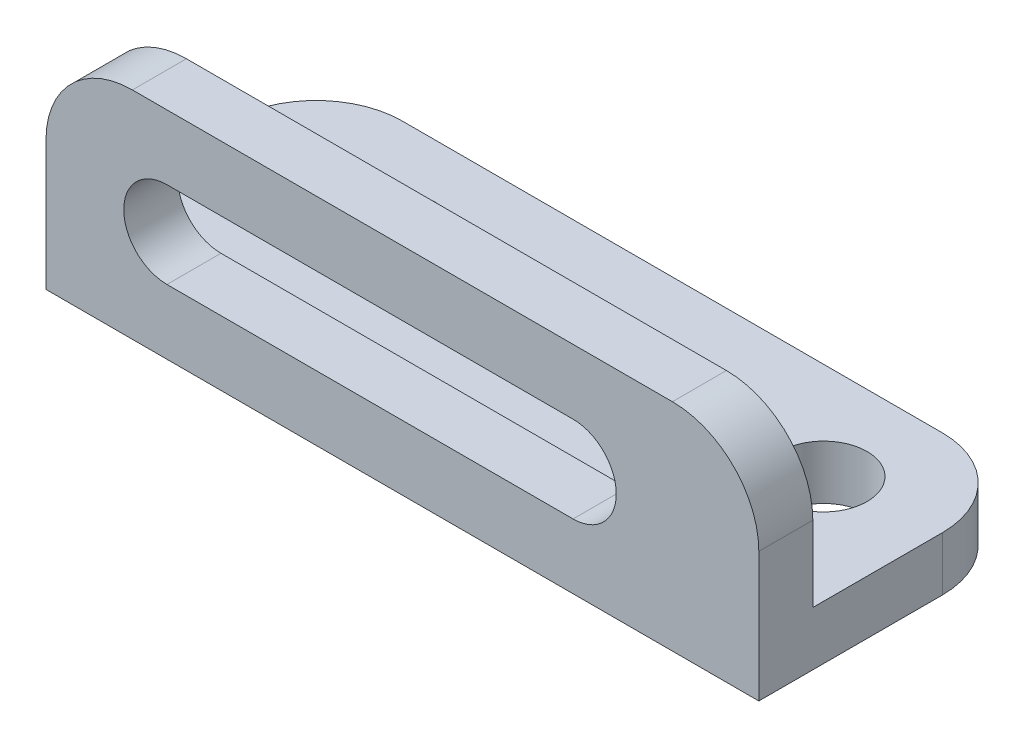
ISO-10303-21;
HEADER;
FILE_DESCRIPTION(('STEP AP214'),'2;1');
FILE_NAME('part.step','',(''),(''),'','','');
FILE_SCHEMA(('AUTOMOTIVE_DESIGN { 1 0 10303 214 1 1 1 1 }'));
ENDSEC;
DATA;
#1=APPLICATION_CONTEXT('core data for automotive mechanical design processes');
#2=APPLICATION_PROTOCOL_DEFINITION('international standard','automotive_design',2000,#1);
#3=PRODUCT_CONTEXT('',#1,'mechanical');
#4=PRODUCT('Part','Part','',(#3));
#5=PRODUCT_RELATED_PRODUCT_CATEGORY('part','',(#4));
#6=PRODUCT_DEFINITION_FORMATION('','',#4);
#7=PRODUCT_DEFINITION_CONTEXT('part definition',#1,'design');
#8=PRODUCT_DEFINITION('design','',#6,#7);
#9=PRODUCT_DEFINITION_SHAPE('','',#8);
#10=(LENGTH_UNIT() NAMED_UNIT(*) SI_UNIT(.MILLI.,.METRE.));
#11=(NAMED_UNIT(*) PLANE_ANGLE_UNIT() SI_UNIT($,.RADIAN.));
#12=(NAMED_UNIT(*) SI_UNIT($,.STERADIAN.) SOLID_ANGLE_UNIT());
#13=UNCERTAINTY_MEASURE_WITH_UNIT(LENGTH_MEASURE(1.E-05),#10,'distance_accuracy_value','');
#14=(GEOMETRIC_REPRESENTATION_CONTEXT(3) GLOBAL_UNCERTAINTY_ASSIGNED_CONTEXT((#13)) GLOBAL_UNIT_ASSIGNED_CONTEXT((#10,
#11,#12)) REPRESENTATION_CONTEXT('',''));
#15=CARTESIAN_POINT('',(0.,0.,0.));
#16=DIRECTION('',(0.,0.,1.));
#17=DIRECTION('',(1.,0.,0.));
#18=AXIS2_PLACEMENT_3D('',#15,#16,#17);
#19=CARTESIAN_POINT('',(-20.955,-6.35,-15.875));
#20=DIRECTION('',(-1.,0.,0.));
#21=DIRECTION('',(0.,0.,1.));
#22=AXIS2_PLACEMENT_3D('',#19,#20,#21);
#23=PLANE('',#22);
#24=DIRECTION('',(0.,0.,-1.));
#25=VECTOR('',#24,1.);
#26=CARTESIAN_POINT('',(-20.955,-3.175,-3.175));
#27=LINE('',#26,#25);
#28=CARTESIAN_POINT('',(-20.955,-3.175,-3.175));
#29=VERTEX_POINT('',#28);
#30=CARTESIAN_POINT('',(-20.955,-3.175,-10.795));
#31=VERTEX_POINT('',#30);
#32=EDGE_CURVE('E171',#29,#31,#27,.T.);
#33=ORIENTED_EDGE('',*,*,#32,.T.);
#34=DIRECTION('',(0.,1.,0.));
#35=VECTOR('',#34,1.);
#36=CARTESIAN_POINT('',(-20.955,-6.35,-10.795));
#37=LINE('',#36,#35);
#38=CARTESIAN_POINT('',(-20.955,-6.35,-10.795));
#39=VERTEX_POINT('',#38);
#40=EDGE_CURVE('E234',#31,#39,#37,.F.);
#41=ORIENTED_EDGE('',*,*,#40,.T.);
#42=DIRECTION('',(0.,0.,1.));
#43=VECTOR('',#42,1.);
#44=CARTESIAN_POINT('',(-20.955,-6.35,-15.875));
#45=LINE('',#44,#43);
#46=CARTESIAN_POINT('',(-20.955,-6.35,0.));
#47=VERTEX_POINT('',#46);
#48=EDGE_CURVE('E188',#39,#47,#45,.T.);
#49=ORIENTED_EDGE('',*,*,#48,.T.);
#50=DIRECTION('',(0.,1.,0.));
#51=VECTOR('',#50,1.);
#52=CARTESIAN_POINT('',(-20.955,-6.35,0.));
#53=LINE('',#52,#51);
#54=CARTESIAN_POINT('',(-20.955,1.27,0.));
#55=VERTEX_POINT('',#54);
#56=EDGE_CURVE('E199',#47,#55,#53,.T.);
#57=ORIENTED_EDGE('',*,*,#56,.T.);
#58=DIRECTION('',(0.,0.,1.));
#59=VECTOR('',#58,1.);
#60=CARTESIAN_POINT('',(-20.955,1.27,-15.875));
#61=LINE('',#60,#59);
#62=CARTESIAN_POINT('',(-20.955,1.27,-3.175));
#63=VERTEX_POINT('',#62);
#64=EDGE_CURVE('E232',#55,#63,#61,.F.);
#65=ORIENTED_EDGE('',*,*,#64,.T.);
#66=DIRECTION('',(0.,-1.,0.));
#67=VECTOR('',#66,1.);
#68=CARTESIAN_POINT('',(-20.955,6.35,-3.175));
#69=LINE('',#68,#67);
#70=EDGE_CURVE('E169',#63,#29,#69,.T.);
#71=ORIENTED_EDGE('',*,*,#70,.T.);
#72=EDGE_LOOP('',(#33,#41,#49,#57,#65,#71));
#73=FACE_BOUND('',#72,.T.);
#74=ADVANCED_FACE('F33',(#73),#23,.T.);
#75=CARTESIAN_POINT('',(20.955,-6.35,-15.875));
#76=DIRECTION('',(0.,0.,-1.));
#77=DIRECTION('',(-1.,0.,0.));
#78=AXIS2_PLACEMENT_3D('',#75,#76,#77);
#79=PLANE('',#78);
#80=DIRECTION('',(1.,0.,0.));
#81=VECTOR('',#80,1.);
#82=CARTESIAN_POINT('',(-20.955,-3.175,-15.875));
#83=LINE('',#82,#81);
#84=CARTESIAN_POINT('',(-15.875,-3.175,-15.875));
#85=VERTEX_POINT('',#84);
#86=CARTESIAN_POINT('',(15.875,-3.175,-15.875));
#87=VERTEX_POINT('',#86);
#88=EDGE_CURVE('E183',#85,#87,#83,.T.);
#89=ORIENTED_EDGE('',*,*,#88,.T.);
#90=DIRECTION('',(0.,1.,0.));
#91=VECTOR('',#90,1.);
#92=CARTESIAN_POINT('',(15.875,-6.35,-15.875));
#93=LINE('',#92,#91);
#94=CARTESIAN_POINT('',(15.875,-6.35,-15.875));
#95=VERTEX_POINT('',#94);
#96=EDGE_CURVE('E226',#87,#95,#93,.F.);
#97=ORIENTED_EDGE('',*,*,#96,.T.);
#98=DIRECTION('',(-1.,0.,0.));
#99=VECTOR('',#98,1.);
#100=CARTESIAN_POINT('',(20.955,-6.35,-15.875));
#101=LINE('',#100,#99);
#102=CARTESIAN_POINT('',(-15.875,-6.35,-15.875));
#103=VERTEX_POINT('',#102);
#104=EDGE_CURVE('E196',#95,#103,#101,.T.);
#105=ORIENTED_EDGE('',*,*,#104,.T.);
#106=DIRECTION('',(0.,1.,0.));
#107=VECTOR('',#106,1.);
#108=CARTESIAN_POINT('',(-15.875,-6.35,-15.875));
#109=LINE('',#108,#107);
#110=EDGE_CURVE('E223',#103,#85,#109,.T.);
#111=ORIENTED_EDGE('',*,*,#110,.T.);
#112=EDGE_LOOP('',(#89,#97,#105,#111));
#113=FACE_BOUND('',#112,.T.);
#114=ADVANCED_FACE('F279',(#113),#79,.T.);
#115=CARTESIAN_POINT('',(20.955,-6.35,0.));
#116=DIRECTION('',(1.,0.,0.));
#117=DIRECTION('',(0.,0.,-1.));
#118=AXIS2_PLACEMENT_3D('',#115,#116,#117);
#119=PLANE('',#118);
#120=DIRECTION('',(0.,0.,-1.));
#121=VECTOR('',#120,1.);
#122=CARTESIAN_POINT('',(20.955,-6.35,0.));
#123=LINE('',#122,#121);
#124=CARTESIAN_POINT('',(20.955,-6.35,0.));
#125=VERTEX_POINT('',#124);
#126=CARTESIAN_POINT('',(20.955,-6.35,-10.795));
#127=VERTEX_POINT('',#126);
#128=EDGE_CURVE('E193',#125,#127,#123,.T.);
#129=ORIENTED_EDGE('',*,*,#128,.T.);
#130=DIRECTION('',(0.,1.,0.));
#131=VECTOR('',#130,1.);
#132=CARTESIAN_POINT('',(20.955,-6.35,-10.795));
#133=LINE('',#132,#131);
#134=CARTESIAN_POINT('',(20.955,-3.175,-10.795));
#135=VERTEX_POINT('',#134);
#136=EDGE_CURVE('E216',#127,#135,#133,.T.);
#137=ORIENTED_EDGE('',*,*,#136,.T.);
#138=DIRECTION('',(0.,0.,-1.));
#139=VECTOR('',#138,1.);
#140=CARTESIAN_POINT('',(20.955,-3.175,-3.175));
#141=LINE('',#140,#139);
#142=CARTESIAN_POINT('',(20.955,-3.175,-3.175));
#143=VERTEX_POINT('',#142);
#144=EDGE_CURVE('E172',#143,#135,#141,.T.);
#145=ORIENTED_EDGE('',*,*,#144,.F.);
#146=DIRECTION('',(0.,-1.,0.));
#147=VECTOR('',#146,1.);
#148=CARTESIAN_POINT('',(20.955,6.35,-3.175));
#149=LINE('',#148,#147);
#150=CARTESIAN_POINT('',(20.955,1.27,-3.175));
#151=VERTEX_POINT('',#150);
#152=EDGE_CURVE('E166',#151,#143,#149,.T.);
#153=ORIENTED_EDGE('',*,*,#152,.F.);
#154=DIRECTION('',(0.,0.,-1.));
#155=VECTOR('',#154,1.);
#156=CARTESIAN_POINT('',(20.955,1.27,0.));
#157=LINE('',#156,#155);
#158=CARTESIAN_POINT('',(20.955,1.27,0.));
#159=VERTEX_POINT('',#158);
#160=EDGE_CURVE('E214',#151,#159,#157,.F.);
#161=ORIENTED_EDGE('',*,*,#160,.T.);
#162=DIRECTION('',(0.,1.,0.));
#163=VECTOR('',#162,1.);
#164=CARTESIAN_POINT('',(20.955,-6.35,0.));
#165=LINE('',#164,#163);
#166=EDGE_CURVE('E201',#125,#159,#165,.T.);
#167=ORIENTED_EDGE('',*,*,#166,.F.);
#168=EDGE_LOOP('',(#129,#137,#145,#153,#161,#167));
#169=FACE_BOUND('',#168,.T.);
#170=ADVANCED_FACE('F263',(#169),#119,.T.);
#171=CARTESIAN_POINT('',(-20.955,-6.35,0.));
#172=DIRECTION('',(0.,0.,1.));
#173=DIRECTION('',(1.,0.,0.));
#174=AXIS2_PLACEMENT_3D('',#171,#172,#173);
#175=PLANE('',#174);
#176=CARTESIAN_POINT('',(-13.843,0.,0.));
#177=DIRECTION('',(0.,0.,1.));
#178=DIRECTION('',(1.,0.,0.));
#179=AXIS2_PLACEMENT_3D('',#176,#177,#178);
#180=CIRCLE('',#179,2.54000000000001);
#181=CARTESIAN_POINT('',(-13.843,2.54000000000001,0.));
#182=VERTEX_POINT('',#181);
#183=CARTESIAN_POINT('',(-13.843,-2.54,0.));
#184=VERTEX_POINT('',#183);
#185=EDGE_CURVE('E155',#182,#184,#180,.T.);
#186=ORIENTED_EDGE('',*,*,#185,.F.);
#187=DIRECTION('',(-1.,0.,0.));
#188=VECTOR('',#187,1.);
#189=CARTESIAN_POINT('',(10.033,2.54000000000001,0.));
#190=LINE('',#189,#188);
#191=CARTESIAN_POINT('',(10.033,2.54000000000001,0.));
#192=VERTEX_POINT('',#191);
#193=EDGE_CURVE('E159',#192,#182,#190,.T.);
#194=ORIENTED_EDGE('',*,*,#193,.F.);
#195=CARTESIAN_POINT('',(10.033,0.,0.));
#196=DIRECTION('',(0.,0.,1.));
#197=DIRECTION('',(1.,0.,0.));
#198=AXIS2_PLACEMENT_3D('',#195,#196,#197);
#199=CIRCLE('',#198,2.54000000000001);
#200=CARTESIAN_POINT('',(10.033,-2.54,0.));
#201=VERTEX_POINT('',#200);
#202=EDGE_CURVE('E139',#201,#192,#199,.T.);
#203=ORIENTED_EDGE('',*,*,#202,.F.);
#204=DIRECTION('',(1.,0.,0.));
#205=VECTOR('',#204,1.);
#206=CARTESIAN_POINT('',(-13.843,-2.54,0.));
#207=LINE('',#206,#205);
#208=EDGE_CURVE('E150',#184,#201,#207,.T.);
#209=ORIENTED_EDGE('',*,*,#208,.F.);
#210=EDGE_LOOP('',(#186,#194,#203,#209));
#211=FACE_BOUND('',#210,.T.);
#212=ORIENTED_EDGE('',*,*,#166,.T.);
#213=CARTESIAN_POINT('',(15.875,1.27,0.));
#214=DIRECTION('',(0.,0.,1.));
#215=DIRECTION('',(1.,0.,0.));
#216=AXIS2_PLACEMENT_3D('',#213,#214,#215);
#217=CIRCLE('',#216,5.08);
#218=CARTESIAN_POINT('',(15.875,6.35,0.));
#219=VERTEX_POINT('',#218);
#220=EDGE_CURVE('E11',#159,#219,#217,.T.);
#221=ORIENTED_EDGE('',*,*,#220,.T.);
#222=DIRECTION('',(1.,0.,0.));
#223=VECTOR('',#222,1.);
#224=CARTESIAN_POINT('',(-20.955,6.35,0.));
#225=LINE('',#224,#223);
#226=CARTESIAN_POINT('',(-15.875,6.35,0.));
#227=VERTEX_POINT('',#226);
#228=EDGE_CURVE('E182',#227,#219,#225,.T.);
#229=ORIENTED_EDGE('',*,*,#228,.F.);
#230=CARTESIAN_POINT('',(-15.875,1.27,0.));
#231=DIRECTION('',(0.,0.,1.));
#232=DIRECTION('',(1.,0.,0.));
#233=AXIS2_PLACEMENT_3D('',#230,#231,#232);
#234=CIRCLE('',#233,5.08);
#235=EDGE_CURVE('E41',#227,#55,#234,.T.);
#236=ORIENTED_EDGE('',*,*,#235,.T.);
#237=ORIENTED_EDGE('',*,*,#56,.F.);
#238=DIRECTION('',(1.,0.,0.));
#239=VECTOR('',#238,1.);
#240=CARTESIAN_POINT('',(-20.955,-6.35,0.));
#241=LINE('',#240,#239);
#242=EDGE_CURVE('E190',#47,#125,#241,.T.);
#243=ORIENTED_EDGE('',*,*,#242,.T.);
#244=EDGE_LOOP('',(#212,#221,#229,#236,#237,#243));
#245=FACE_BOUND('',#244,.T.);
#246=ADVANCED_FACE('F157',(#211,#245),#175,.T.);
#247=CARTESIAN_POINT('',(0.,-6.35,0.));
#248=DIRECTION('',(0.,1.,0.));
#249=DIRECTION('',(0.,0.,1.));
#250=AXIS2_PLACEMENT_3D('',#247,#248,#249);
#251=PLANE('',#250);
#252=CARTESIAN_POINT('',(-10.795,-6.35,-10.16));
#253=DIRECTION('',(0.,-1.,0.));
#254=DIRECTION('',(0.,0.,-1.));
#255=AXIS2_PLACEMENT_3D('',#252,#253,#254);
#256=CIRCLE('',#255,2.55270000000001);
#257=CARTESIAN_POINT('',(-10.795,-6.35,-12.7127));
#258=VERTEX_POINT('',#257);
#259=EDGE_CURVE('E347',#258,#258,#256,.T.);
#260=ORIENTED_EDGE('',*,*,#259,.F.);
#261=EDGE_LOOP('',(#260));
#262=FACE_BOUND('',#261,.T.);
#263=CARTESIAN_POINT('',(14.605,-6.35,-10.16));
#264=DIRECTION('',(0.,-1.,0.));
#265=DIRECTION('',(0.,0.,-1.));
#266=AXIS2_PLACEMENT_3D('',#263,#264,#265);
#267=CIRCLE('',#266,2.55270000000001);
#268=CARTESIAN_POINT('',(14.605,-6.35,-12.7127));
#269=VERTEX_POINT('',#268);
#270=EDGE_CURVE('E336',#269,#269,#267,.T.);
#271=ORIENTED_EDGE('',*,*,#270,.F.);
#272=EDGE_LOOP('',(#271));
#273=FACE_BOUND('',#272,.T.);
#274=ORIENTED_EDGE('',*,*,#104,.F.);
#275=CARTESIAN_POINT('',(15.875,-6.35,-10.795));
#276=DIRECTION('',(0.,1.,0.));
#277=DIRECTION('',(0.,0.,1.));
#278=AXIS2_PLACEMENT_3D('',#275,#276,#277);
#279=CIRCLE('',#278,5.08);
#280=EDGE_CURVE('E230',#95,#127,#279,.F.);
#281=ORIENTED_EDGE('',*,*,#280,.T.);
#282=ORIENTED_EDGE('',*,*,#128,.F.);
#283=ORIENTED_EDGE('',*,*,#242,.F.);
#284=ORIENTED_EDGE('',*,*,#48,.F.);
#285=CARTESIAN_POINT('',(-15.875,-6.35,-10.795));
#286=DIRECTION('',(0.,1.,0.));
#287=DIRECTION('',(0.,0.,1.));
#288=AXIS2_PLACEMENT_3D('',#285,#286,#287);
#289=CIRCLE('',#288,5.08);
#290=EDGE_CURVE('E228',#39,#103,#289,.F.);
#291=ORIENTED_EDGE('',*,*,#290,.T.);
#292=EDGE_LOOP('',(#274,#281,#282,#283,#284,#291));
#293=FACE_BOUND('',#292,.T.);
#294=ADVANCED_FACE('F276',(#262,#273,#293),#251,.F.);
#295=CARTESIAN_POINT('',(0.,6.35,0.));
#296=DIRECTION('',(0.,1.,0.));
#297=DIRECTION('',(0.,0.,1.));
#298=AXIS2_PLACEMENT_3D('',#295,#296,#297);
#299=PLANE('',#298);
#300=ORIENTED_EDGE('',*,*,#228,.T.);
#301=DIRECTION('',(0.,0.,-1.));
#302=VECTOR('',#301,1.);
#303=CARTESIAN_POINT('',(15.875,6.35,0.));
#304=LINE('',#303,#302);
#305=CARTESIAN_POINT('',(15.875,6.35,-3.175));
#306=VERTEX_POINT('',#305);
#307=EDGE_CURVE('E238',#219,#306,#304,.T.);
#308=ORIENTED_EDGE('',*,*,#307,.T.);
#309=DIRECTION('',(1.,0.,0.));
#310=VECTOR('',#309,1.);
#311=CARTESIAN_POINT('',(-20.955,6.35,-3.175));
#312=LINE('',#311,#310);
#313=CARTESIAN_POINT('',(-15.875,6.35,-3.175));
#314=VERTEX_POINT('',#313);
#315=EDGE_CURVE('E179',#314,#306,#312,.T.);
#316=ORIENTED_EDGE('',*,*,#315,.F.);
#317=DIRECTION('',(0.,0.,1.));
#318=VECTOR('',#317,1.);
#319=CARTESIAN_POINT('',(-15.875,6.35,0.));
#320=LINE('',#319,#318);
#321=EDGE_CURVE('E236',#314,#227,#320,.T.);
#322=ORIENTED_EDGE('',*,*,#321,.T.);
#323=EDGE_LOOP('',(#300,#308,#316,#322));
#324=FACE_BOUND('',#323,.T.);
#325=ADVANCED_FACE('F255',(#324),#299,.T.);
#326=CARTESIAN_POINT('',(-20.955,6.35,-3.175));
#327=DIRECTION('',(0.,0.,1.));
#328=DIRECTION('',(1.,0.,0.));
#329=AXIS2_PLACEMENT_3D('',#326,#327,#328);
#330=PLANE('',#329);
#331=DIRECTION('',(-1.,0.,0.));
#332=VECTOR('',#331,1.);
#333=CARTESIAN_POINT('',(-20.955,2.54000000000001,-3.175));
#334=LINE('',#333,#332);
#335=CARTESIAN_POINT('',(10.033,2.54000000000001,-3.175));
#336=VERTEX_POINT('',#335);
#337=CARTESIAN_POINT('',(-13.843,2.54000000000001,-3.175));
#338=VERTEX_POINT('',#337);
#339=EDGE_CURVE('E208',#336,#338,#334,.T.);
#340=ORIENTED_EDGE('',*,*,#339,.T.);
#341=CARTESIAN_POINT('',(-13.843,0.,-3.175));
#342=DIRECTION('',(0.,0.,1.));
#343=DIRECTION('',(1.,0.,0.));
#344=AXIS2_PLACEMENT_3D('',#341,#342,#343);
#345=CIRCLE('',#344,2.54000000000001);
#346=CARTESIAN_POINT('',(-13.843,-2.54,-3.175));
#347=VERTEX_POINT('',#346);
#348=EDGE_CURVE('E211',#338,#347,#345,.T.);
#349=ORIENTED_EDGE('',*,*,#348,.T.);
#350=DIRECTION('',(1.,0.,0.));
#351=VECTOR('',#350,1.);
#352=CARTESIAN_POINT('',(-20.955,-2.54,-3.175));
#353=LINE('',#352,#351);
#354=CARTESIAN_POINT('',(10.033,-2.54,-3.175));
#355=VERTEX_POINT('',#354);
#356=EDGE_CURVE('E203',#347,#355,#353,.T.);
#357=ORIENTED_EDGE('',*,*,#356,.T.);
#358=CARTESIAN_POINT('',(10.033,0.,-3.175));
#359=DIRECTION('',(0.,0.,1.));
#360=DIRECTION('',(1.,0.,0.));
#361=AXIS2_PLACEMENT_3D('',#358,#359,#360);
#362=CIRCLE('',#361,2.54000000000001);
#363=EDGE_CURVE('E142',#355,#336,#362,.T.);
#364=ORIENTED_EDGE('',*,*,#363,.T.);
#365=EDGE_LOOP('',(#340,#349,#357,#364));
#366=FACE_BOUND('',#365,.T.);
#367=ORIENTED_EDGE('',*,*,#315,.T.);
#368=CARTESIAN_POINT('',(15.875,1.27,-3.175));
#369=DIRECTION('',(0.,0.,1.));
#370=DIRECTION('',(1.,0.,0.));
#371=AXIS2_PLACEMENT_3D('',#368,#369,#370);
#372=CIRCLE('',#371,5.08);
#373=EDGE_CURVE('E243',#306,#151,#372,.F.);
#374=ORIENTED_EDGE('',*,*,#373,.T.);
#375=ORIENTED_EDGE('',*,*,#152,.T.);
#376=DIRECTION('',(1.,0.,0.));
#377=VECTOR('',#376,1.);
#378=CARTESIAN_POINT('',(-20.955,-3.175,-3.175));
#379=LINE('',#378,#377);
#380=EDGE_CURVE('E175',#29,#143,#379,.T.);
#381=ORIENTED_EDGE('',*,*,#380,.F.);
#382=ORIENTED_EDGE('',*,*,#70,.F.);
#383=CARTESIAN_POINT('',(-15.875,1.27,-3.175));
#384=DIRECTION('',(0.,0.,1.));
#385=DIRECTION('',(1.,0.,0.));
#386=AXIS2_PLACEMENT_3D('',#383,#384,#385);
#387=CIRCLE('',#386,5.08);
#388=EDGE_CURVE('E241',#63,#314,#387,.F.);
#389=ORIENTED_EDGE('',*,*,#388,.T.);
#390=EDGE_LOOP('',(#367,#374,#375,#381,#382,#389));
#391=FACE_BOUND('',#390,.T.);
#392=ADVANCED_FACE('F252',(#366,#391),#330,.F.);
#393=CARTESIAN_POINT('',(-20.955,-3.175,-3.175));
#394=DIRECTION('',(0.,-1.,0.));
#395=DIRECTION('',(0.,0.,-1.));
#396=AXIS2_PLACEMENT_3D('',#393,#394,#395);
#397=PLANE('',#396);
#398=CARTESIAN_POINT('',(-10.795,-3.175,-10.16));
#399=DIRECTION('',(0.,-1.,0.));
#400=DIRECTION('',(0.,0.,-1.));
#401=AXIS2_PLACEMENT_3D('',#398,#399,#400);
#402=CIRCLE('',#401,2.55270000000001);
#403=CARTESIAN_POINT('',(-10.795,-3.175,-12.7127));
#404=VERTEX_POINT('',#403);
#405=EDGE_CURVE('E342',#404,#404,#402,.T.);
#406=ORIENTED_EDGE('',*,*,#405,.T.);
#407=EDGE_LOOP('',(#406));
#408=FACE_BOUND('',#407,.T.);
#409=CARTESIAN_POINT('',(14.605,-3.175,-10.16));
#410=DIRECTION('',(0.,-1.,0.));
#411=DIRECTION('',(0.,0.,-1.));
#412=AXIS2_PLACEMENT_3D('',#409,#410,#411);
#413=CIRCLE('',#412,2.55270000000001);
#414=CARTESIAN_POINT('',(14.605,-3.175,-12.7127));
#415=VERTEX_POINT('',#414);
#416=EDGE_CURVE('E339',#415,#415,#413,.T.);
#417=ORIENTED_EDGE('',*,*,#416,.T.);
#418=EDGE_LOOP('',(#417));
#419=FACE_BOUND('',#418,.T.);
#420=ORIENTED_EDGE('',*,*,#144,.T.);
#421=CARTESIAN_POINT('',(15.875,-3.175,-10.795));
#422=DIRECTION('',(0.,-1.,0.));
#423=DIRECTION('',(0.,0.,-1.));
#424=AXIS2_PLACEMENT_3D('',#421,#422,#423);
#425=CIRCLE('',#424,5.08);
#426=EDGE_CURVE('E221',#135,#87,#425,.F.);
#427=ORIENTED_EDGE('',*,*,#426,.T.);
#428=ORIENTED_EDGE('',*,*,#88,.F.);
#429=CARTESIAN_POINT('',(-15.875,-3.175,-10.795));
#430=DIRECTION('',(0.,-1.,0.));
#431=DIRECTION('',(0.,0.,-1.));
#432=AXIS2_PLACEMENT_3D('',#429,#430,#431);
#433=CIRCLE('',#432,5.08);
#434=EDGE_CURVE('E219',#85,#31,#433,.F.);
#435=ORIENTED_EDGE('',*,*,#434,.T.);
#436=ORIENTED_EDGE('',*,*,#32,.F.);
#437=ORIENTED_EDGE('',*,*,#380,.T.);
#438=EDGE_LOOP('',(#420,#427,#428,#435,#436,#437));
#439=FACE_BOUND('',#438,.T.);
#440=ADVANCED_FACE('F266',(#408,#419,#439),#397,.F.);
#441=CARTESIAN_POINT('',(-13.843,0.,-15.875));
#442=DIRECTION('',(0.,0.,1.));
#443=DIRECTION('',(1.,0.,0.));
#444=AXIS2_PLACEMENT_3D('',#441,#442,#443);
#445=CYLINDRICAL_SURFACE('',#444,2.54000000000001);
#446=DIRECTION('',(0.,0.,1.));
#447=VECTOR('',#446,1.);
#448=CARTESIAN_POINT('',(-13.843,2.54000000000001,-15.875));
#449=LINE('',#448,#447);
#450=EDGE_CURVE('E164',#338,#182,#449,.T.);
#451=ORIENTED_EDGE('',*,*,#450,.T.);
#452=ORIENTED_EDGE('',*,*,#185,.T.);
#453=DIRECTION('',(0.,0.,1.));
#454=VECTOR('',#453,1.);
#455=CARTESIAN_POINT('',(-13.843,-2.54,-15.875));
#456=LINE('',#455,#454);
#457=EDGE_CURVE('E146',#347,#184,#456,.T.);
#458=ORIENTED_EDGE('',*,*,#457,.F.);
#459=ORIENTED_EDGE('',*,*,#348,.F.);
#460=EDGE_LOOP('',(#451,#452,#458,#459));
#461=FACE_BOUND('',#460,.T.);
#462=ADVANCED_FACE('F316',(#461),#445,.F.);
#463=CARTESIAN_POINT('',(10.033,2.54000000000001,-15.875));
#464=DIRECTION('',(0.,1.,0.));
#465=DIRECTION('',(-1.,0.,0.));
#466=AXIS2_PLACEMENT_3D('',#463,#464,#465);
#467=PLANE('',#466);
#468=DIRECTION('',(0.,0.,1.));
#469=VECTOR('',#468,1.);
#470=CARTESIAN_POINT('',(10.033,2.54000000000001,-15.875));
#471=LINE('',#470,#469);
#472=EDGE_CURVE('E145',#336,#192,#471,.T.);
#473=ORIENTED_EDGE('',*,*,#472,.T.);
#474=ORIENTED_EDGE('',*,*,#193,.T.);
#475=ORIENTED_EDGE('',*,*,#450,.F.);
#476=ORIENTED_EDGE('',*,*,#339,.F.);
#477=EDGE_LOOP('',(#473,#474,#475,#476));
#478=FACE_BOUND('',#477,.T.);
#479=ADVANCED_FACE('F320',(#478),#467,.F.);
#480=CARTESIAN_POINT('',(10.033,0.,-15.875));
#481=DIRECTION('',(0.,0.,1.));
#482=DIRECTION('',(1.,0.,0.));
#483=AXIS2_PLACEMENT_3D('',#480,#481,#482);
#484=CYLINDRICAL_SURFACE('',#483,2.54000000000001);
#485=DIRECTION('',(0.,0.,1.));
#486=VECTOR('',#485,1.);
#487=CARTESIAN_POINT('',(10.033,-2.54,-15.875));
#488=LINE('',#487,#486);
#489=EDGE_CURVE('E134',#355,#201,#488,.T.);
#490=ORIENTED_EDGE('',*,*,#489,.T.);
#491=ORIENTED_EDGE('',*,*,#202,.T.);
#492=ORIENTED_EDGE('',*,*,#472,.F.);
#493=ORIENTED_EDGE('',*,*,#363,.F.);
#494=EDGE_LOOP('',(#490,#491,#492,#493));
#495=FACE_BOUND('',#494,.T.);
#496=ADVANCED_FACE('F136',(#495),#484,.F.);
#497=CARTESIAN_POINT('',(-13.843,-2.54,-15.875));
#498=DIRECTION('',(0.,-1.,0.));
#499=DIRECTION('',(1.,0.,0.));
#500=AXIS2_PLACEMENT_3D('',#497,#498,#499);
#501=PLANE('',#500);
#502=ORIENTED_EDGE('',*,*,#457,.T.);
#503=ORIENTED_EDGE('',*,*,#208,.T.);
#504=ORIENTED_EDGE('',*,*,#489,.F.);
#505=ORIENTED_EDGE('',*,*,#356,.F.);
#506=EDGE_LOOP('',(#502,#503,#504,#505));
#507=FACE_BOUND('',#506,.T.);
#508=ADVANCED_FACE('F151',(#507),#501,.F.);
#509=CARTESIAN_POINT('',(14.605,-6.35,-10.16));
#510=DIRECTION('',(0.,-1.,0.));
#511=DIRECTION('',(0.,0.,-1.));
#512=AXIS2_PLACEMENT_3D('',#509,#510,#511);
#513=CYLINDRICAL_SURFACE('',#512,2.55270000000001);
#514=ORIENTED_EDGE('',*,*,#270,.T.);
#515=EDGE_LOOP('',(#514));
#516=FACE_BOUND('',#515,.T.);
#517=ORIENTED_EDGE('',*,*,#416,.F.);
#518=EDGE_LOOP('',(#517));
#519=FACE_BOUND('',#518,.T.);
#520=ADVANCED_FACE('F292',(#516,#519),#513,.F.);
#521=CARTESIAN_POINT('',(-10.795,-6.35,-10.16));
#522=DIRECTION('',(0.,-1.,0.));
#523=DIRECTION('',(0.,0.,-1.));
#524=AXIS2_PLACEMENT_3D('',#521,#522,#523);
#525=CYLINDRICAL_SURFACE('',#524,2.55270000000001);
#526=ORIENTED_EDGE('',*,*,#259,.T.);
#527=EDGE_LOOP('',(#526));
#528=FACE_BOUND('',#527,.T.);
#529=ORIENTED_EDGE('',*,*,#405,.F.);
#530=EDGE_LOOP('',(#529));
#531=FACE_BOUND('',#530,.T.);
#532=ADVANCED_FACE('F285',(#528,#531),#525,.F.);
#533=CARTESIAN_POINT('',(15.875,-6.35,-10.795));
#534=DIRECTION('',(0.,1.,0.));
#535=DIRECTION('',(0.,0.,1.));
#536=AXIS2_PLACEMENT_3D('',#533,#534,#535);
#537=CYLINDRICAL_SURFACE('',#536,5.08);
#538=ORIENTED_EDGE('',*,*,#280,.F.);
#539=ORIENTED_EDGE('',*,*,#96,.F.);
#540=ORIENTED_EDGE('',*,*,#426,.F.);
#541=ORIENTED_EDGE('',*,*,#136,.F.);
#542=EDGE_LOOP('',(#538,#539,#540,#541));
#543=FACE_BOUND('',#542,.T.);
#544=ADVANCED_FACE('F282',(#543),#537,.T.);
#545=CARTESIAN_POINT('',(-15.875,-6.35,-10.795));
#546=DIRECTION('',(0.,1.,0.));
#547=DIRECTION('',(0.,0.,1.));
#548=AXIS2_PLACEMENT_3D('',#545,#546,#547);
#549=CYLINDRICAL_SURFACE('',#548,5.08);
#550=ORIENTED_EDGE('',*,*,#290,.F.);
#551=ORIENTED_EDGE('',*,*,#40,.F.);
#552=ORIENTED_EDGE('',*,*,#434,.F.);
#553=ORIENTED_EDGE('',*,*,#110,.F.);
#554=EDGE_LOOP('',(#550,#551,#552,#553));
#555=FACE_BOUND('',#554,.T.);
#556=ADVANCED_FACE('F272',(#555),#549,.T.);
#557=CARTESIAN_POINT('',(15.875,1.27,0.));
#558=DIRECTION('',(0.,0.,-1.));
#559=DIRECTION('',(-1.,0.,0.));
#560=AXIS2_PLACEMENT_3D('',#557,#558,#559);
#561=CYLINDRICAL_SURFACE('',#560,5.08);
#562=ORIENTED_EDGE('',*,*,#220,.F.);
#563=ORIENTED_EDGE('',*,*,#160,.F.);
#564=ORIENTED_EDGE('',*,*,#373,.F.);
#565=ORIENTED_EDGE('',*,*,#307,.F.);
#566=EDGE_LOOP('',(#562,#563,#564,#565));
#567=FACE_BOUND('',#566,.T.);
#568=ADVANCED_FACE('F258',(#567),#561,.T.);
#569=CARTESIAN_POINT('',(-15.875,1.27,0.));
#570=DIRECTION('',(0.,0.,1.));
#571=DIRECTION('',(1.,0.,0.));
#572=AXIS2_PLACEMENT_3D('',#569,#570,#571);
#573=CYLINDRICAL_SURFACE('',#572,5.08);
#574=ORIENTED_EDGE('',*,*,#388,.F.);
#575=ORIENTED_EDGE('',*,*,#64,.F.);
#576=ORIENTED_EDGE('',*,*,#235,.F.);
#577=ORIENTED_EDGE('',*,*,#321,.F.);
#578=EDGE_LOOP('',(#574,#575,#576,#577));
#579=FACE_BOUND('',#578,.T.);
#580=ADVANCED_FACE('F35',(#579),#573,.T.);
#581=CLOSED_SHELL('',(#74,#114,#170,#246,#294,#325,#392,#440,#462,#479,#496,#508,#520,#532,#544,
#556,#568,#580));
#582=MANIFOLD_SOLID_BREP('B2',#581);
#583=ADVANCED_BREP_SHAPE_REPRESENTATION('',(#18,#582),#14);
#584=SHAPE_DEFINITION_REPRESENTATION(#9,#583);
ENDSEC;
END-ISO-10303-21;
